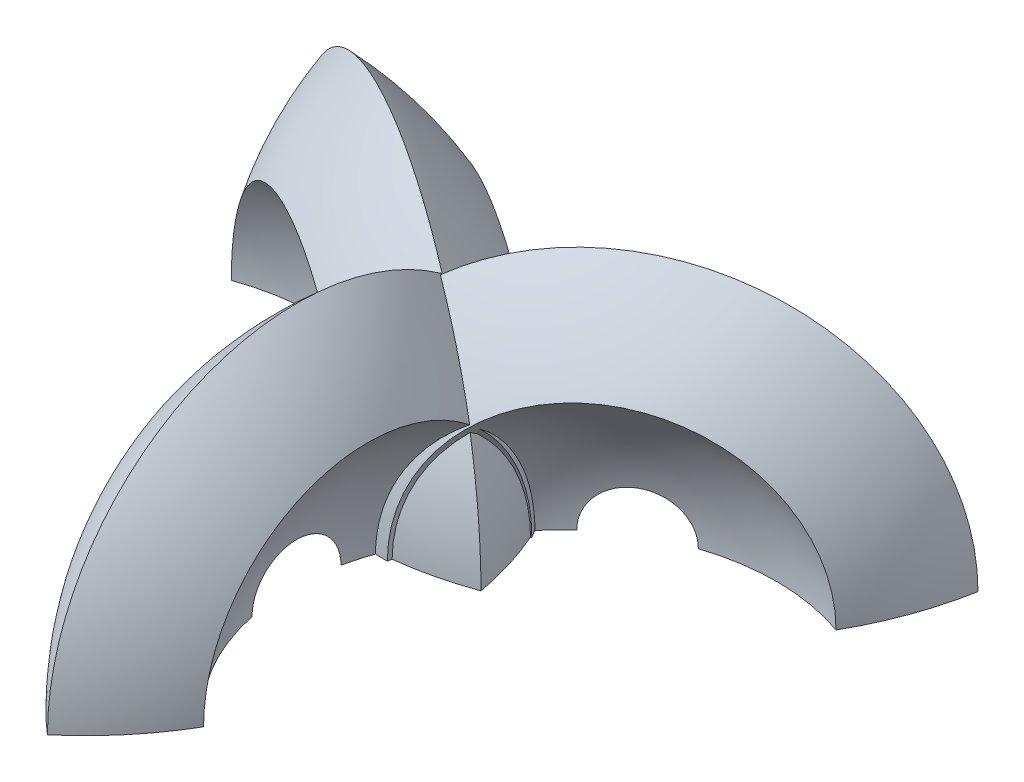
ISO-10303-21;
HEADER;
FILE_DESCRIPTION(('STEP AP214'),'2;1');
FILE_NAME('part.step','',(''),(''),'','','');
FILE_SCHEMA(('AUTOMOTIVE_DESIGN { 1 0 10303 214 1 1 1 1 }'));
ENDSEC;
DATA;
#1=APPLICATION_CONTEXT('core data for automotive mechanical design processes');
#2=APPLICATION_PROTOCOL_DEFINITION('international standard','automotive_design',2000,#1);
#3=PRODUCT_CONTEXT('',#1,'mechanical');
#4=PRODUCT('Part','Part','',(#3));
#5=PRODUCT_RELATED_PRODUCT_CATEGORY('part','',(#4));
#6=PRODUCT_DEFINITION_FORMATION('','',#4);
#7=PRODUCT_DEFINITION_CONTEXT('part definition',#1,'design');
#8=PRODUCT_DEFINITION('design','',#6,#7);
#9=PRODUCT_DEFINITION_SHAPE('','',#8);
#10=(LENGTH_UNIT() NAMED_UNIT(*) SI_UNIT(.MILLI.,.METRE.));
#11=(NAMED_UNIT(*) PLANE_ANGLE_UNIT() SI_UNIT($,.RADIAN.));
#12=(NAMED_UNIT(*) SI_UNIT($,.STERADIAN.) SOLID_ANGLE_UNIT());
#13=UNCERTAINTY_MEASURE_WITH_UNIT(LENGTH_MEASURE(1.E-05),#10,'distance_accuracy_value','');
#14=(GEOMETRIC_REPRESENTATION_CONTEXT(3) GLOBAL_UNCERTAINTY_ASSIGNED_CONTEXT((#13)) GLOBAL_UNIT_ASSIGNED_CONTEXT((#10,
#11,#12)) REPRESENTATION_CONTEXT('',''));
#15=CARTESIAN_POINT('',(0.,0.,0.));
#16=DIRECTION('',(0.,0.,1.));
#17=DIRECTION('',(1.,0.,0.));
#18=AXIS2_PLACEMENT_3D('',#15,#16,#17);
#19=CARTESIAN_POINT('',(-124.668530376757,0.,84.6505013948495));
#20=DIRECTION('',(-1.,0.,0.));
#21=DIRECTION('',(0.,0.,1.));
#22=AXIS2_PLACEMENT_3D('',#19,#20,#21);
#23=SPHERICAL_SURFACE('',#22,192.278);
#24=CARTESIAN_POINT('',(-129.95417514935,0.,74.795868958211));
#25=DIRECTION('',(-0.472664474793678,0.,-0.881242471892961));
#26=DIRECTION('',(-0.881242471892961,0.,0.472664474793678));
#27=AXIS2_PLACEMENT_3D('',#24,#25,#26);
#28=CIRCLE('',#27,191.952539610386);
#29=CARTESIAN_POINT('',(38.9671504604131,10.1232696352737,-15.8070152619315));
#30=VERTEX_POINT('',#29);
#31=CARTESIAN_POINT('',(39.2025553430375,-3.51186386520022E-13,-15.9332773620447));
#32=VERTEX_POINT('',#31);
#33=EDGE_CURVE('E313',#30,#32,#28,.T.);
#34=ORIENTED_EDGE('',*,*,#33,.F.);
#35=CARTESIAN_POINT('',(45.4636600559884,0.,72.0736056438837));
#36=DIRECTION('',(0.997278750361292,0.,-0.0737230905335674));
#37=DIRECTION('',(-0.0737230905335674,0.,-0.997278750361292));
#38=AXIS2_PLACEMENT_3D('',#35,#36,#37);
#39=CIRCLE('',#38,88.6999929866146);
#40=CARTESIAN_POINT('',(41.5264130904534,70.8201955717852,18.8130504333721));
#41=VERTEX_POINT('',#40);
#42=EDGE_CURVE('E391',#41,#30,#39,.F.);
#43=ORIENTED_EDGE('',*,*,#42,.F.);
#44=CARTESIAN_POINT('',(41.5264130904534,0.,84.6505013948495));
#45=DIRECTION('',(-1.,0.,0.));
#46=DIRECTION('',(0.,0.,1.));
#47=AXIS2_PLACEMENT_3D('',#44,#45,#46);
#48=CIRCLE('',#47,96.6957602479594);
#49=CARTESIAN_POINT('',(41.5264130904534,-3.33066907387547E-13,-12.0452588531098));
#50=VERTEX_POINT('',#49);
#51=EDGE_CURVE('E419',#41,#50,#48,.T.);
#52=ORIENTED_EDGE('',*,*,#51,.T.);
#53=CARTESIAN_POINT('',(-124.668530376757,0.,84.6505013948495));
#54=DIRECTION('',(0.,1.,0.));
#55=DIRECTION('',(1.,0.,0.));
#56=AXIS2_PLACEMENT_3D('',#53,#54,#55);
#57=CIRCLE('',#56,192.278);
#58=EDGE_CURVE('E395',#50,#32,#57,.T.);
#59=ORIENTED_EDGE('',*,*,#58,.T.);
#60=EDGE_LOOP('',(#34,#43,#52,#59));
#61=FACE_BOUND('',#60,.T.);
#62=ADVANCED_FACE('F38',(#61),#23,.T.);
#63=CARTESIAN_POINT('',(-50.7386392394072,0.,-68.9236544968015));
#64=DIRECTION('',(0.433752647348546,0.,-0.901031986623187));
#65=DIRECTION('',(-0.901031986623187,0.,-0.433752647348546));
#66=AXIS2_PLACEMENT_3D('',#63,#64,#65);
#67=CIRCLE('',#66,88.9953882096511);
#68=CARTESIAN_POINT('',(29.4490521994365,-4.01423188324392E-13,-30.3216692590538));
#69=VERTEX_POINT('',#68);
#70=CARTESIAN_POINT('',(-0.403929917464598,69.2781335055556,-44.6927573188496));
#71=VERTEX_POINT('',#70);
#72=EDGE_CURVE('E326',#69,#71,#67,.F.);
#73=ORIENTED_EDGE('',*,*,#72,.F.);
#74=CARTESIAN_POINT('',(-0.403929917464602,-5.13478148889135E-13,-62.0776089204288));
#75=VERTEX_POINT('',#74);
#76=EDGE_CURVE('E394',#69,#75,#57,.T.);
#77=ORIENTED_EDGE('',*,*,#76,.T.);
#78=CARTESIAN_POINT('',(-0.403929917464602,0.,84.6505013948495));
#79=DIRECTION('',(-1.,0.,0.));
#80=DIRECTION('',(0.,0.,1.));
#81=AXIS2_PLACEMENT_3D('',#78,#79,#80);
#82=CIRCLE('',#81,146.728110315278);
#83=EDGE_CURVE('E429',#71,#75,#82,.T.);
#84=ORIENTED_EDGE('',*,*,#83,.F.);
#85=EDGE_LOOP('',(#73,#77,#84));
#86=FACE_BOUND('',#85,.T.);
#87=ADVANCED_FACE('F519',(#86),#23,.T.);
#88=CARTESIAN_POINT('',(-68.0540382717353,0.,-32.9544714044507));
#89=DIRECTION('',(0.433752647348546,0.,-0.901031986623187));
#90=DIRECTION('',(-0.901031986623187,0.,-0.433752647348546));
#91=AXIS2_PLACEMENT_3D('',#88,#89,#90);
#92=CIRCLE('',#91,141.190293365253);
#93=CARTESIAN_POINT('',(-0.403929917464602,119.572522269939,-0.38802090356254));
#94=VERTEX_POINT('',#93);
#95=CARTESIAN_POINT('',(0.166197988731771,119.17287066736,-0.113563956071941));
#96=VERTEX_POINT('',#95);
#97=EDGE_CURVE('E306',#94,#96,#92,.T.);
#98=ORIENTED_EDGE('',*,*,#97,.F.);
#99=CARTESIAN_POINT('',(-0.403929917464602,-5.11118769209887E-13,231.378611710128));
#100=VERTEX_POINT('',#99);
#101=EDGE_CURVE('E430',#100,#94,#82,.T.);
#102=ORIENTED_EDGE('',*,*,#101,.F.);
#103=CARTESIAN_POINT('',(-124.668530376757,0.,84.6505013948495));
#104=DIRECTION('',(0.,-1.,0.));
#105=DIRECTION('',(1.,0.,0.));
#106=AXIS2_PLACEMENT_3D('',#103,#104,#105);
#107=CIRCLE('',#106,192.278);
#108=CARTESIAN_POINT('',(41.5264130904534,-3.42155977514452E-13,181.346261642809));
#109=VERTEX_POINT('',#108);
#110=EDGE_CURVE('E407',#109,#100,#107,.T.);
#111=ORIENTED_EDGE('',*,*,#110,.F.);
#112=CARTESIAN_POINT('',(41.5264130904534,75.747260840894,24.5470695042128));
#113=VERTEX_POINT('',#112);
#114=EDGE_CURVE('E420',#109,#113,#48,.T.);
#115=ORIENTED_EDGE('',*,*,#114,.T.);
#116=CARTESIAN_POINT('',(-56.6446904983197,0.,-32.4706182607864));
#117=DIRECTION('',(0.502235060310112,0.,-0.864731139832086));
#118=DIRECTION('',(-0.864731139832086,0.,-0.502235060310112));
#119=AXIS2_PLACEMENT_3D('',#116,#117,#118);
#120=CIRCLE('',#119,136.477946287314);
#121=CARTESIAN_POINT('',(0.215528319611667,119.593213683353,0.553745164838883));
#122=VERTEX_POINT('',#121);
#123=EDGE_CURVE('E372',#122,#113,#120,.T.);
#124=ORIENTED_EDGE('',*,*,#123,.F.);
#125=CARTESIAN_POINT('',(5.71977308335733,0.,75.0116429542923));
#126=DIRECTION('',(0.997278750361292,0.,-0.0737230905335674));
#127=DIRECTION('',(-0.0737230905335674,0.,-0.997278750361292));
#128=AXIS2_PLACEMENT_3D('',#125,#126,#127);
#129=CIRCLE('',#128,140.98514819922);
#130=EDGE_CURVE('E385',#96,#122,#129,.T.);
#131=ORIENTED_EDGE('',*,*,#130,.F.);
#132=EDGE_LOOP('',(#98,#102,#111,#115,#124,#131));
#133=FACE_BOUND('',#132,.T.);
#134=ADVANCED_FACE('F502',(#133),#23,.T.);
#135=CARTESIAN_POINT('',(123.860670541828,0.,84.6505013948495));
#136=DIRECTION('',(-1.,0.,0.));
#137=DIRECTION('',(0.,0.,1.));
#138=AXIS2_PLACEMENT_3D('',#135,#136,#137);
#139=SPHERICAL_SURFACE('',#138,192.278);
#140=CARTESIAN_POINT('',(37.0613763484214,0.,-66.2439891084989));
#141=DIRECTION('',(-0.498622054425052,0.,-0.866819500727193));
#142=DIRECTION('',(-0.866819500727193,0.,0.498622054425052));
#143=AXIS2_PLACEMENT_3D('',#140,#141,#142);
#144=CIRCLE('',#143,81.6551562809196);
#145=CARTESIAN_POINT('',(-4.60172868255597,66.0104840789844,-42.2780504017154));
#146=VERTEX_POINT('',#145);
#147=EDGE_CURVE('E53',#71,#146,#144,.F.);
#148=ORIENTED_EDGE('',*,*,#147,.F.);
#149=ORIENTED_EDGE('',*,*,#83,.T.);
#150=CARTESIAN_POINT('',(123.860670541828,0.,84.6505013948495));
#151=DIRECTION('',(0.,1.,0.));
#152=DIRECTION('',(1.,0.,0.));
#153=AXIS2_PLACEMENT_3D('',#150,#151,#152);
#154=CIRCLE('',#153,192.278);
#155=CARTESIAN_POINT('',(-30.6764375356947,-3.99452192276867E-13,-29.7571535546171));
#156=VERTEX_POINT('',#155);
#157=EDGE_CURVE('E397',#75,#156,#154,.T.);
#158=ORIENTED_EDGE('',*,*,#157,.T.);
#159=CARTESIAN_POINT('',(50.2601061040626,0.,-68.6223282256695));
#160=DIRECTION('',(-0.432872581520415,0.,-0.901455117112245));
#161=DIRECTION('',(-0.901455117112245,0.,0.432872581520415));
#162=AXIS2_PLACEMENT_3D('',#159,#160,#161);
#163=CIRCLE('',#162,89.7843299165381);
#164=EDGE_CURVE('E387',#146,#156,#163,.F.);
#165=ORIENTED_EDGE('',*,*,#164,.F.);
#166=EDGE_LOOP('',(#148,#149,#158,#165));
#167=FACE_BOUND('',#166,.T.);
#168=ADVANCED_FACE('F40',(#167),#139,.T.);
#169=CARTESIAN_POINT('',(37.0613763484214,0.,-66.2439891084989));
#170=DIRECTION('',(-0.498622054425052,0.,-0.866819500727193));
#171=DIRECTION('',(-0.866819500727193,0.,0.498622054425052));
#172=AXIS2_PLACEMENT_3D('',#169,#170,#171);
#173=CIRCLE('',#172,81.6551562809196);
#174=CARTESIAN_POINT('',(-30.8586778469745,22.9779023980061,-27.1742209143618));
#175=VERTEX_POINT('',#174);
#176=CARTESIAN_POINT('',(-33.7189054508063,-3.84689419314794E-13,-25.5289273293082));
#177=VERTEX_POINT('',#176);
#178=EDGE_CURVE('E239',#175,#177,#173,.F.);
#179=ORIENTED_EDGE('',*,*,#178,.F.);
#180=CARTESIAN_POINT('',(129.984373542649,0.,75.0116429542927));
#181=DIRECTION('',(0.536244828514143,0.,-0.844062488143998));
#182=DIRECTION('',(-0.844062488143998,0.,-0.536244828514144));
#183=AXIS2_PLACEMENT_3D('',#180,#181,#182);
#184=CIRCLE('',#183,191.938589016176);
#185=CARTESIAN_POINT('',(-32.0237894731927,-3.93018367142207E-13,-27.9144327979334));
#186=VERTEX_POINT('',#185);
#187=EDGE_CURVE('E382',#186,#175,#184,.T.);
#188=ORIENTED_EDGE('',*,*,#187,.F.);
#189=EDGE_CURVE('E401',#186,#177,#154,.T.);
#190=ORIENTED_EDGE('',*,*,#189,.T.);
#191=EDGE_LOOP('',(#179,#188,#190));
#192=FACE_BOUND('',#191,.T.);
#193=ADVANCED_FACE('F528',(#192),#139,.T.);
#194=CARTESIAN_POINT('',(56.2105621875569,0.,-32.9544714044507));
#195=DIRECTION('',(-0.498622054425052,0.,-0.866819500727193));
#196=DIRECTION('',(-0.866819500727193,0.,0.498622054425052));
#197=AXIS2_PLACEMENT_3D('',#194,#195,#196);
#198=CIRCLE('',#197,136.247431155715);
#199=CARTESIAN_POINT('',(-42.0106451206223,75.6552202855051,23.5454805867388));
#200=VERTEX_POINT('',#199);
#201=EDGE_CURVE('E61',#200,#94,#198,.T.);
#202=ORIENTED_EDGE('',*,*,#201,.F.);
#203=CARTESIAN_POINT('',(-45.6777758383489,0.,71.7540451205685));
#204=DIRECTION('',(-0.997119322550888,0.,-0.0758489063576901));
#205=DIRECTION('',(-0.0758489063576901,0.,0.997119322550888));
#206=AXIS2_PLACEMENT_3D('',#203,#204,#205);
#207=CIRCLE('',#206,89.7843299165372);
#208=CARTESIAN_POINT('',(-38.8677326061215,-3.57605013176243E-13,-17.7716451014946));
#209=VERTEX_POINT('',#208);
#210=EDGE_CURVE('E295',#209,#200,#207,.F.);
#211=ORIENTED_EDGE('',*,*,#210,.F.);
#212=CARTESIAN_POINT('',(-42.3342729253825,-3.33066907387547E-13,-12.0452588531099));
#213=VERTEX_POINT('',#212);
#214=EDGE_CURVE('E259',#209,#213,#154,.T.);
#215=ORIENTED_EDGE('',*,*,#214,.T.);
#216=CARTESIAN_POINT('',(-42.3342729253825,0.,84.6505013948495));
#217=DIRECTION('',(-1.,0.,0.));
#218=DIRECTION('',(0.,0.,1.));
#219=AXIS2_PLACEMENT_3D('',#216,#217,#218);
#220=CIRCLE('',#219,96.6957602479594);
#221=CARTESIAN_POINT('',(-42.3342729253825,-3.42155977514453E-13,181.346261642809));
#222=VERTEX_POINT('',#221);
#223=EDGE_CURVE('E426',#222,#213,#220,.T.);
#224=ORIENTED_EDGE('',*,*,#223,.F.);
#225=CARTESIAN_POINT('',(123.860670541828,0.,84.6505013948495));
#226=DIRECTION('',(0.,-1.,0.));
#227=DIRECTION('',(1.,0.,0.));
#228=AXIS2_PLACEMENT_3D('',#225,#226,#227);
#229=CIRCLE('',#228,192.278);
#230=EDGE_CURVE('E410',#100,#222,#229,.T.);
#231=ORIENTED_EDGE('',*,*,#230,.F.);
#232=ORIENTED_EDGE('',*,*,#101,.T.);
#233=EDGE_LOOP('',(#202,#211,#215,#224,#231,#232));
#234=FACE_BOUND('',#233,.T.);
#235=ADVANCED_FACE('F496',(#234),#139,.T.);
#236=CARTESIAN_POINT('',(-124.668530376757,0.,84.6505013948495));
#237=DIRECTION('',(-1.,0.,0.));
#238=DIRECTION('',(0.,0.,1.));
#239=AXIS2_PLACEMENT_3D('',#236,#237,#238);
#240=SPHERICAL_SURFACE('',#239,127.);
#241=CARTESIAN_POINT('',(-85.3694373040633,0.,3.01471168790013));
#242=DIRECTION('',(0.433752647348546,0.,-0.901031986623187));
#243=DIRECTION('',(-0.901031986623187,0.,-0.433752647348546));
#244=AXIS2_PLACEMENT_3D('',#241,#242,#243);
#245=CIRCLE('',#244,88.9953882096512);
#246=CARTESIAN_POINT('',(-8.10000083926831,23.7904453092196,40.2118624254039));
#247=VERTEX_POINT('',#246);
#248=CARTESIAN_POINT('',(-38.3369613817749,72.0798211251422,25.655928920492));
#249=VERTEX_POINT('',#248);
#250=EDGE_CURVE('E297',#247,#249,#245,.F.);
#251=ORIENTED_EDGE('',*,*,#250,.F.);
#252=CARTESIAN_POINT('',(-75.9656527928002,0.,0.79555343428124));
#253=DIRECTION('',(0.502235060310112,0.,-0.864731139832086));
#254=DIRECTION('',(-0.864731139832086,0.,-0.502235060310112));
#255=AXIS2_PLACEMENT_3D('',#252,#253,#254);
#256=CIRCLE('',#255,82.0083984575516);
#257=CARTESIAN_POINT('',(-5.05043691879777,-3.69653506053159E-13,41.9830463795454));
#258=VERTEX_POINT('',#257);
#259=EDGE_CURVE('E376',#258,#247,#256,.F.);
#260=ORIENTED_EDGE('',*,*,#259,.F.);
#261=CARTESIAN_POINT('',(-124.668530376757,0.,84.6505013948495));
#262=DIRECTION('',(0.,-1.,0.));
#263=DIRECTION('',(1.,0.,0.));
#264=AXIS2_PLACEMENT_3D('',#261,#262,#263);
#265=CIRCLE('',#264,127.);
#266=CARTESIAN_POINT('',(-0.403929917464574,0.,58.433921284307));
#267=VERTEX_POINT('',#266);
#268=EDGE_CURVE('E400',#258,#267,#265,.T.);
#269=ORIENTED_EDGE('',*,*,#268,.T.);
#270=CARTESIAN_POINT('',(-0.403929917464574,0.,84.6505013948495));
#271=DIRECTION('',(-1.,0.,0.));
#272=DIRECTION('',(0.,0.,1.));
#273=AXIS2_PLACEMENT_3D('',#270,#271,#272);
#274=CIRCLE('',#273,26.2165801105425);
#275=CARTESIAN_POINT('',(-0.403929917464574,0.,110.867081505392));
#276=VERTEX_POINT('',#275);
#277=EDGE_CURVE('E423',#276,#267,#274,.T.);
#278=ORIENTED_EDGE('',*,*,#277,.F.);
#279=CARTESIAN_POINT('',(-124.668530376757,0.,84.6505013948495));
#280=DIRECTION('',(0.,1.,0.));
#281=DIRECTION('',(1.,0.,0.));
#282=AXIS2_PLACEMENT_3D('',#279,#280,#281);
#283=CIRCLE('',#282,127.);
#284=EDGE_CURVE('E413',#222,#276,#283,.T.);
#285=ORIENTED_EDGE('',*,*,#284,.F.);
#286=ORIENTED_EDGE('',*,*,#223,.T.);
#287=CARTESIAN_POINT('',(-40.5633515025527,-3.32247406505919E-13,-10.5089378980454));
#288=VERTEX_POINT('',#287);
#289=EDGE_CURVE('E402',#213,#288,#265,.T.);
#290=ORIENTED_EDGE('',*,*,#289,.T.);
#291=CARTESIAN_POINT('',(-34.0241138892737,0.,77.9496802647009));
#292=DIRECTION('',(0.997278750361292,0.,-0.0737230905335674));
#293=DIRECTION('',(-0.0737230905335674,0.,-0.997278750361292));
#294=AXIS2_PLACEMENT_3D('',#291,#292,#293);
#295=CIRCLE('',#294,88.6999929866146);
#296=CARTESIAN_POINT('',(-38.1019938363555,69.3405278792349,22.7867321528413));
#297=VERTEX_POINT('',#296);
#298=EDGE_CURVE('E379',#297,#288,#295,.F.);
#299=ORIENTED_EDGE('',*,*,#298,.F.);
#300=CARTESIAN_POINT('',(-35.6465103322736,67.4638661183998,24.2128747409323));
#301=VERTEX_POINT('',#300);
#302=EDGE_CURVE('E375',#301,#297,#256,.F.);
#303=ORIENTED_EDGE('',*,*,#302,.F.);
#304=CARTESIAN_POINT('',(-129.95417514935,0.,74.7958689582107));
#305=DIRECTION('',(-0.472664474793678,0.,-0.881242471892961));
#306=DIRECTION('',(-0.881242471892961,0.,0.472664474793678));
#307=AXIS2_PLACEMENT_3D('',#304,#305,#306);
#308=CIRCLE('',#307,126.506711991407);
#309=EDGE_CURVE('E292',#249,#301,#308,.T.);
#310=ORIENTED_EDGE('',*,*,#309,.F.);
#311=EDGE_LOOP('',(#251,#260,#269,#278,#285,#286,#290,#299,#303,#310));
#312=FACE_BOUND('',#311,.T.);
#313=ADVANCED_FACE('F477',(#312),#240,.F.);
#314=CARTESIAN_POINT('',(123.860670541828,0.,84.6505013948495));
#315=DIRECTION('',(-1.,0.,0.));
#316=DIRECTION('',(0.,0.,1.));
#317=AXIS2_PLACEMENT_3D('',#314,#315,#316);
#318=SPHERICAL_SURFACE('',#317,127.);
#319=CARTESIAN_POINT('',(34.2986264582324,0.,77.8376927958533));
#320=DIRECTION('',(-0.997119322550888,0.,-0.0758489063576901));
#321=DIRECTION('',(-0.0758489063576901,0.,0.997119322550888));
#322=AXIS2_PLACEMENT_3D('',#319,#320,#321);
#323=CIRCLE('',#322,89.7843299165372);
#324=CARTESIAN_POINT('',(41.1086696904598,-3.36364070845889E-13,-11.6879974262097));
#325=VERTEX_POINT('',#324);
#326=CARTESIAN_POINT('',(38.9147300116422,66.0104840789842,17.1538112604408));
#327=VERTEX_POINT('',#326);
#328=EDGE_CURVE('E310',#325,#327,#323,.F.);
#329=ORIENTED_EDGE('',*,*,#328,.F.);
#330=CARTESIAN_POINT('',(123.860670541828,0.,84.6505013948495));
#331=DIRECTION('',(0.,-1.,0.));
#332=DIRECTION('',(1.,0.,0.));
#333=AXIS2_PLACEMENT_3D('',#330,#331,#332);
#334=CIRCLE('',#333,127.);
#335=EDGE_CURVE('E404',#325,#50,#334,.T.);
#336=ORIENTED_EDGE('',*,*,#335,.T.);
#337=ORIENTED_EDGE('',*,*,#51,.F.);
#338=CARTESIAN_POINT('',(129.984373542649,0.,75.0116429542926));
#339=DIRECTION('',(0.536244828514143,0.,-0.844062488143998));
#340=DIRECTION('',(-0.844062488143998,0.,-0.536244828514144));
#341=AXIS2_PLACEMENT_3D('',#338,#339,#340);
#342=CIRCLE('',#341,126.485543322234);
#343=EDGE_CURVE('E389',#327,#41,#342,.T.);
#344=ORIENTED_EDGE('',*,*,#343,.F.);
#345=EDGE_LOOP('',(#329,#336,#337,#344));
#346=FACE_BOUND('',#345,.T.);
#347=ADVANCED_FACE('F456',(#346),#318,.F.);
#348=CARTESIAN_POINT('',(136.108076543472,0.,65.3727845137351));
#349=DIRECTION('',(0.501867130525979,0.,0.864944728463976));
#350=DIRECTION('',(0.864944728463976,0.,-0.501867130525979));
#351=AXIS2_PLACEMENT_3D('',#348,#349,#350);
#352=SPHERICAL_SURFACE('',#351,192.278);
#353=CARTESIAN_POINT('',(39.854031490831,0.,-75.4925855242141));
#354=DIRECTION('',(-0.564174691148556,0.,-0.82565544742794));
#355=DIRECTION('',(-0.82565544742794,0.,0.564174691148556));
#356=AXIS2_PLACEMENT_3D('',#353,#354,#355);
#357=CIRCLE('',#356,88.673195606541);
#358=CARTESIAN_POINT('',(-4.47779559113292,70.5691801499423,-45.2004159152915));
#359=VERTEX_POINT('',#358);
#360=EDGE_CURVE('E322',#359,#175,#357,.F.);
#361=ORIENTED_EDGE('',*,*,#360,.F.);
#362=CARTESIAN_POINT('',(52.7002010029481,0.,-78.3768214537765));
#363=DIRECTION('',(0.501867130525979,0.,0.864944728463976));
#364=DIRECTION('',(0.864944728463976,0.,-0.501867130525979));
#365=AXIS2_PLACEMENT_3D('',#362,#363,#364);
#366=CIRCLE('',#365,96.6954309468744);
#367=CARTESIAN_POINT('',(-30.9360022611033,-3.60822483003176E-13,-29.8485629894957));
#368=VERTEX_POINT('',#367);
#369=EDGE_CURVE('E362',#359,#368,#366,.T.);
#370=ORIENTED_EDGE('',*,*,#369,.T.);
#371=CARTESIAN_POINT('',(136.108076543472,0.,65.3727845137351));
#372=DIRECTION('',(0.,1.,0.));
#373=DIRECTION('',(-0.501867130525979,0.,-0.864944728463976));
#374=AXIS2_PLACEMENT_3D('',#371,#372,#373);
#375=CIRCLE('',#374,192.278);
#376=EDGE_CURVE('E336',#368,#186,#375,.T.);
#377=ORIENTED_EDGE('',*,*,#376,.T.);
#378=ORIENTED_EDGE('',*,*,#187,.T.);
#379=EDGE_LOOP('',(#361,#370,#377,#378));
#380=FACE_BOUND('',#379,.T.);
#381=ADVANCED_FACE('F526',(#380),#352,.T.);
#382=CARTESIAN_POINT('',(0.434128310763754,0.,65.1570105176537));
#383=DIRECTION('',(-0.999998735338019,0.,-0.00159038434431163));
#384=DIRECTION('',(-0.00159038434431163,0.,0.999998735338019));
#385=AXIS2_PLACEMENT_3D('',#382,#383,#384);
#386=CIRCLE('',#385,136.247431155714);
#387=CARTESIAN_POINT('',(0.538338153738816,119.456453929357,-0.367849279702834));
#388=VERTEX_POINT('',#387);
#389=CARTESIAN_POINT('',(0.614338227881655,75.6552202855054,-48.1550261972011));
#390=VERTEX_POINT('',#389);
#391=EDGE_CURVE('E319',#388,#390,#386,.T.);
#392=ORIENTED_EDGE('',*,*,#391,.F.);
#393=CARTESIAN_POINT('',(62.3342651883789,0.,-42.5933298450079));
#394=DIRECTION('',(-0.564174691148556,0.,-0.82565544742794));
#395=DIRECTION('',(-0.82565544742794,0.,0.564174691148556));
#396=AXIS2_PLACEMENT_3D('',#393,#394,#395);
#397=CIRCLE('',#396,140.966564093823);
#398=EDGE_CURVE('E303',#96,#388,#397,.T.);
#399=ORIENTED_EDGE('',*,*,#398,.F.);
#400=ORIENTED_EDGE('',*,*,#130,.T.);
#401=CARTESIAN_POINT('',(73.7436129617944,0.,-42.1094767013436));
#402=DIRECTION('',(0.501867130525979,0.,0.864944728463976));
#403=DIRECTION('',(0.864944728463976,0.,-0.501867130525979));
#404=AXIS2_PLACEMENT_3D('',#401,#402,#403);
#405=CIRCLE('',#404,146.727865418479);
#406=CARTESIAN_POINT('',(200.655106674279,-5.11117059104678E-13,-115.747369487118));
#407=VERTEX_POINT('',#406);
#408=EDGE_CURVE('E359',#407,#122,#405,.T.);
#409=ORIENTED_EDGE('',*,*,#408,.F.);
#410=CARTESIAN_POINT('',(136.108076543472,0.,65.3727845137351));
#411=DIRECTION('',(0.,-1.,0.));
#412=DIRECTION('',(-0.501867130525979,0.,-0.864944728463976));
#413=AXIS2_PLACEMENT_3D('',#410,#411,#412);
#414=CIRCLE('',#413,192.278);
#415=CARTESIAN_POINT('',(136.336404266999,-3.14398102401638E-13,-126.905079918057));
#416=VERTEX_POINT('',#415);
#417=EDGE_CURVE('E349',#416,#407,#414,.T.);
#418=ORIENTED_EDGE('',*,*,#417,.F.);
#419=EDGE_CURVE('E363',#416,#390,#366,.T.);
#420=ORIENTED_EDGE('',*,*,#419,.T.);
#421=EDGE_LOOP('',(#392,#399,#400,#409,#418,#420));
#422=FACE_BOUND('',#421,.T.);
#423=ADVANCED_FACE('F585',(#422),#352,.T.);
#424=CARTESIAN_POINT('',(11.3791493801173,0.,-149.591737916422));
#425=DIRECTION('',(0.501867130525979,0.,0.864944728463976));
#426=DIRECTION('',(0.864944728463976,0.,-0.501867130525979));
#427=AXIS2_PLACEMENT_3D('',#424,#425,#426);
#428=SPHERICAL_SURFACE('',#427,127.);
#429=CARTESIAN_POINT('',(-0.0301983932988956,0.,-150.075591060087));
#430=DIRECTION('',(-0.999101971371275,0.,-0.0423704000692854));
#431=DIRECTION('',(-0.0423704000692854,0.,0.999101971371275));
#432=AXIS2_PLACEMENT_3D('',#429,#430,#431);
#433=CIRCLE('',#432,126.485543322234);
#434=EDGE_CURVE('E11',#146,#359,#433,.T.);
#435=ORIENTED_EDGE('',*,*,#434,.F.);
#436=ORIENTED_EDGE('',*,*,#164,.T.);
#437=CARTESIAN_POINT('',(11.3791493801173,0.,-149.591737916422));
#438=DIRECTION('',(0.,-1.,0.));
#439=DIRECTION('',(-0.501867130525979,0.,-0.864944728463976));
#440=AXIS2_PLACEMENT_3D('',#437,#438,#439);
#441=CIRCLE('',#440,127.);
#442=EDGE_CURVE('E332',#156,#368,#441,.T.);
#443=ORIENTED_EDGE('',*,*,#442,.T.);
#444=ORIENTED_EDGE('',*,*,#369,.F.);
#445=EDGE_LOOP('',(#435,#436,#443,#444));
#446=FACE_BOUND('',#445,.T.);
#447=ADVANCED_FACE('F522',(#446),#428,.F.);
#448=CARTESIAN_POINT('',(-39.3019379795325,0.,-75.4351368246653));
#449=DIRECTION('',(-0.564246741030475,0.,0.825606210754551));
#450=DIRECTION('',(0.825606210754551,0.,0.564246741030475));
#451=AXIS2_PLACEMENT_3D('',#448,#449,#450);
#452=CIRCLE('',#451,89.7843299165372);
#453=CARTESIAN_POINT('',(34.8245624279965,-1.3563001139559E-13,-24.7746212736542));
#454=VERTEX_POINT('',#453);
#455=EDGE_CURVE('E316',#390,#454,#452,.F.);
#456=ORIENTED_EDGE('',*,*,#455,.F.);
#457=ORIENTED_EDGE('',*,*,#419,.F.);
#458=CARTESIAN_POINT('',(11.3791493801173,0.,-149.591737916422));
#459=DIRECTION('',(0.,1.,0.));
#460=DIRECTION('',(-0.501867130525979,0.,-0.864944728463976));
#461=AXIS2_PLACEMENT_3D('',#458,#459,#460);
#462=CIRCLE('',#461,127.);
#463=CARTESIAN_POINT('',(96.4183201771242,0.,-55.2660286418162));
#464=VERTEX_POINT('',#463);
#465=EDGE_CURVE('E346',#464,#416,#462,.T.);
#466=ORIENTED_EDGE('',*,*,#465,.F.);
#467=CARTESIAN_POINT('',(73.7436129617944,0.,-42.1094767013435));
#468=DIRECTION('',(0.501867130525979,0.,0.864944728463976));
#469=DIRECTION('',(0.864944728463976,0.,-0.501867130525979));
#470=AXIS2_PLACEMENT_3D('',#467,#468,#469);
#471=CIRCLE('',#470,26.2152094453446);
#472=CARTESIAN_POINT('',(51.0689057464646,0.,-28.9529247608709));
#473=VERTEX_POINT('',#472);
#474=EDGE_CURVE('E366',#464,#473,#471,.T.);
#475=ORIENTED_EDGE('',*,*,#474,.T.);
#476=EDGE_CURVE('E333',#473,#454,#441,.T.);
#477=ORIENTED_EDGE('',*,*,#476,.T.);
#478=EDGE_LOOP('',(#456,#457,#466,#475,#477));
#479=FACE_BOUND('',#478,.T.);
#480=ADVANCED_FACE('F600',(#479),#428,.F.);
#481=CARTESIAN_POINT('',(136.108076543472,0.,65.3727845137351));
#482=DIRECTION('',(0.501867130525979,0.,0.864944728463976));
#483=DIRECTION('',(0.864944728463976,0.,-0.501867130525979));
#484=AXIS2_PLACEMENT_3D('',#481,#482,#483);
#485=SPHERICAL_SURFACE('',#484,127.);
#486=CARTESIAN_POINT('',(38.838289241769,0.,65.2180879711971));
#487=DIRECTION('',(-0.999998735338019,0.,-0.00159038434431163));
#488=DIRECTION('',(-0.00159038434431163,0.,0.999998735338019));
#489=AXIS2_PLACEMENT_3D('',#486,#487,#488);
#490=CIRCLE('',#489,81.6551562809188);
#491=CARTESIAN_POINT('',(38.9681523239505,-3.91428313586895E-13,-16.4369650435501));
#492=VERTEX_POINT('',#491);
#493=EDGE_CURVE('E46',#492,#30,#490,.F.);
#494=ORIENTED_EDGE('',*,*,#493,.F.);
#495=CARTESIAN_POINT('',(136.108076543472,0.,65.3727845137351));
#496=DIRECTION('',(0.,-1.,0.));
#497=DIRECTION('',(-0.501867130525979,0.,-0.864944728463976));
#498=AXIS2_PLACEMENT_3D('',#495,#496,#497);
#499=CIRCLE('',#498,127.);
#500=EDGE_CURVE('E329',#492,#473,#499,.T.);
#501=ORIENTED_EDGE('',*,*,#500,.T.);
#502=ORIENTED_EDGE('',*,*,#474,.F.);
#503=CARTESIAN_POINT('',(136.108076543472,0.,65.3727845137351));
#504=DIRECTION('',(0.,1.,0.));
#505=DIRECTION('',(-0.501867130525979,0.,-0.864944728463976));
#506=AXIS2_PLACEMENT_3D('',#503,#504,#505);
#507=CIRCLE('',#506,127.);
#508=CARTESIAN_POINT('',(178.423228184692,-3.56031465825081E-13,-54.3703904131915));
#509=VERTEX_POINT('',#508);
#510=EDGE_CURVE('E342',#509,#464,#507,.T.);
#511=ORIENTED_EDGE('',*,*,#510,.F.);
#512=CARTESIAN_POINT('',(94.7870249206407,0.,-5.84213194891074));
#513=DIRECTION('',(0.501867130525979,0.,0.864944728463976));
#514=DIRECTION('',(0.864944728463976,0.,-0.501867130525979));
#515=AXIS2_PLACEMENT_3D('',#512,#513,#514);
#516=CIRCLE('',#515,96.6954309468744);
#517=CARTESIAN_POINT('',(11.1508216565893,-3.19189119579733E-13,42.6861265153701));
#518=VERTEX_POINT('',#517);
#519=EDGE_CURVE('E355',#509,#518,#516,.T.);
#520=ORIENTED_EDGE('',*,*,#519,.T.);
#521=CARTESIAN_POINT('',(11.6009918925429,-3.41890550319119E-13,40.3330985786741));
#522=VERTEX_POINT('',#521);
#523=EDGE_CURVE('E330',#518,#522,#499,.T.);
#524=ORIENTED_EDGE('',*,*,#523,.T.);
#525=CARTESIAN_POINT('',(84.8144988859268,0.,-9.69407416580165));
#526=DIRECTION('',(-0.564174691148556,0.,-0.82565544742794));
#527=DIRECTION('',(-0.82565544742794,0.,0.564174691148556));
#528=AXIS2_PLACEMENT_3D('',#525,#526,#527);
#529=CIRCLE('',#528,88.673195606541);
#530=CARTESIAN_POINT('',(38.907540543492,69.0760898962029,21.6743908822935));
#531=VERTEX_POINT('',#530);
#532=EDGE_CURVE('E300',#531,#522,#529,.F.);
#533=ORIENTED_EDGE('',*,*,#532,.F.);
#534=EDGE_CURVE('E437',#327,#531,#490,.F.);
#535=ORIENTED_EDGE('',*,*,#534,.F.);
#536=ORIENTED_EDGE('',*,*,#343,.T.);
#537=ORIENTED_EDGE('',*,*,#42,.T.);
#538=EDGE_LOOP('',(#494,#501,#502,#511,#520,#524,#533,#535,#536,#537));
#539=FACE_BOUND('',#538,.T.);
#540=ADVANCED_FACE('F448',(#539),#485,.F.);
#541=CARTESIAN_POINT('',(11.3791493801173,0.,-149.591737916422));
#542=DIRECTION('',(0.501867130525979,0.,0.864944728463976));
#543=DIRECTION('',(0.864944728463976,0.,-0.501867130525979));
#544=AXIS2_PLACEMENT_3D('',#541,#542,#543);
#545=SPHERICAL_SURFACE('',#544,192.278);
#546=CARTESIAN_POINT('',(-0.0301983932979085,0.,-150.075591060087));
#547=DIRECTION('',(-0.999101971371275,0.,-0.0423704000692854));
#548=DIRECTION('',(-0.0423704000692854,0.,0.999101971371275));
#549=AXIS2_PLACEMENT_3D('',#546,#547,#548);
#550=CIRCLE('',#549,191.938589016176);
#551=CARTESIAN_POINT('',(-8.16271319864735,-3.58304551206145E-13,41.6906316081962));
#552=VERTEX_POINT('',#551);
#553=EDGE_CURVE('E435',#552,#247,#550,.T.);
#554=ORIENTED_EDGE('',*,*,#553,.F.);
#555=CARTESIAN_POINT('',(11.3791493801173,0.,-149.591737916422));
#556=DIRECTION('',(0.,1.,0.));
#557=DIRECTION('',(-0.501867130525979,0.,-0.864944728463976));
#558=AXIS2_PLACEMENT_3D('',#555,#556,#557);
#559=CIRCLE('',#558,192.278);
#560=EDGE_CURVE('E343',#552,#258,#559,.T.);
#561=ORIENTED_EDGE('',*,*,#560,.T.);
#562=ORIENTED_EDGE('',*,*,#259,.T.);
#563=EDGE_LOOP('',(#554,#561,#562));
#564=FACE_BOUND('',#563,.T.);
#565=ADVANCED_FACE('F473',(#564),#545,.T.);
#566=CARTESIAN_POINT('',(-84.5587325622943,0.,-9.21536457018457));
#567=DIRECTION('',(-0.564246741030475,0.,0.825606210754551));
#568=DIRECTION('',(0.825606210754551,0.,0.564246741030475));
#569=AXIS2_PLACEMENT_3D('',#566,#567,#568);
#570=CIRCLE('',#569,89.7843299165372);
#571=CARTESIAN_POINT('',(-10.4322321547654,-3.85338335801203E-13,41.4451509808266));
#572=VERTEX_POINT('',#571);
#573=EDGE_CURVE('E432',#301,#572,#570,.F.);
#574=ORIENTED_EDGE('',*,*,#573,.F.);
#575=ORIENTED_EDGE('',*,*,#302,.T.);
#576=CARTESIAN_POINT('',(-53.1678807506907,-5.13478148889135E-13,31.5284160844305));
#577=VERTEX_POINT('',#576);
#578=EDGE_CURVE('E358',#297,#577,#405,.T.);
#579=ORIENTED_EDGE('',*,*,#578,.T.);
#580=EDGE_CURVE('E340',#577,#572,#559,.T.);
#581=ORIENTED_EDGE('',*,*,#580,.T.);
#582=EDGE_LOOP('',(#574,#575,#579,#581));
#583=FACE_BOUND('',#582,.T.);
#584=ADVANCED_FACE('F489',(#583),#545,.T.);
#585=CARTESIAN_POINT('',(84.9797138178823,0.,3.68109170409682));
#586=DIRECTION('',(-0.432872581520415,0.,-0.901455117112245));
#587=DIRECTION('',(-0.901455117112245,0.,0.432872581520415));
#588=AXIS2_PLACEMENT_3D('',#585,#586,#587);
#589=CIRCLE('',#588,89.784329916538);
#590=CARTESIAN_POINT('',(4.04317017812507,-1.47006150857549E-13,42.5462663751493));
#591=VERTEX_POINT('',#590);
#592=EDGE_CURVE('E369',#113,#591,#589,.F.);
#593=ORIENTED_EDGE('',*,*,#592,.F.);
#594=ORIENTED_EDGE('',*,*,#114,.F.);
#595=CARTESIAN_POINT('',(123.860670541828,0.,84.6505013948495));
#596=DIRECTION('',(0.,1.,0.));
#597=DIRECTION('',(1.,0.,0.));
#598=AXIS2_PLACEMENT_3D('',#595,#596,#597);
#599=CIRCLE('',#598,127.);
#600=EDGE_CURVE('E416',#276,#109,#599,.T.);
#601=ORIENTED_EDGE('',*,*,#600,.F.);
#602=ORIENTED_EDGE('',*,*,#277,.T.);
#603=EDGE_CURVE('E405',#267,#591,#334,.T.);
#604=ORIENTED_EDGE('',*,*,#603,.T.);
#605=EDGE_LOOP('',(#593,#594,#601,#602,#604));
#606=FACE_BOUND('',#605,.T.);
#607=ADVANCED_FACE('F577',(#606),#318,.F.);
#608=CARTESIAN_POINT('',(-0.403929917464609,0.,84.6505013948495));
#609=DIRECTION('',(0.,-1.,0.));
#610=DIRECTION('',(1.,0.,0.));
#611=AXIS2_PLACEMENT_3D('',#608,#609,#610);
#612=PLANE('',#611);
#613=ORIENTED_EDGE('',*,*,#110,.T.);
#614=ORIENTED_EDGE('',*,*,#230,.T.);
#615=ORIENTED_EDGE('',*,*,#284,.T.);
#616=ORIENTED_EDGE('',*,*,#600,.T.);
#617=EDGE_LOOP('',(#613,#614,#615,#616));
#618=FACE_BOUND('',#617,.T.);
#619=ADVANCED_FACE('F498',(#618),#612,.T.);
#620=CARTESIAN_POINT('',(-0.403929917464609,0.,84.6505013948495));
#621=DIRECTION('',(0.,1.,0.));
#622=DIRECTION('',(1.,0.,0.));
#623=AXIS2_PLACEMENT_3D('',#620,#621,#622);
#624=PLANE('',#623);
#625=ORIENTED_EDGE('',*,*,#76,.F.);
#626=CARTESIAN_POINT('',(-11.4395461667138,0.,-150.559444203751));
#627=DIRECTION('',(0.,-1.,0.));
#628=DIRECTION('',(-0.498130542456249,0.,0.867102048591885));
#629=AXIS2_PLACEMENT_3D('',#626,#627,#628);
#630=CIRCLE('',#629,127.);
#631=CARTESIAN_POINT('',(31.3918591231723,-3.46944695195361E-13,-30.9999580853608));
#632=VERTEX_POINT('',#631);
#633=EDGE_CURVE('E243',#632,#69,#630,.T.);
#634=ORIENTED_EDGE('',*,*,#633,.F.);
#635=CARTESIAN_POINT('',(-135.239819921944,0.,64.9412365215721));
#636=DIRECTION('',(0.,1.,0.));
#637=DIRECTION('',(-0.498130542456249,0.,0.867102048591885));
#638=AXIS2_PLACEMENT_3D('',#635,#636,#637);
#639=CIRCLE('',#638,192.278);
#640=EDGE_CURVE('E269',#454,#632,#639,.T.);
#641=ORIENTED_EDGE('',*,*,#640,.F.);
#642=ORIENTED_EDGE('',*,*,#476,.F.);
#643=ORIENTED_EDGE('',*,*,#500,.F.);
#644=EDGE_CURVE('E274',#32,#492,#639,.T.);
#645=ORIENTED_EDGE('',*,*,#644,.F.);
#646=ORIENTED_EDGE('',*,*,#58,.F.);
#647=ORIENTED_EDGE('',*,*,#335,.F.);
#648=CARTESIAN_POINT('',(53.8883496455481,-5.41233724504764E-13,30.2805273532649));
#649=VERTEX_POINT('',#648);
#650=EDGE_CURVE('E270',#649,#325,#639,.T.);
#651=ORIENTED_EDGE('',*,*,#650,.F.);
#652=CARTESIAN_POINT('',(-11.4395461667138,0.,-150.559444203751));
#653=DIRECTION('',(0.,1.,0.));
#654=DIRECTION('',(-0.498130542456249,0.,0.867102048591885));
#655=AXIS2_PLACEMENT_3D('',#652,#653,#654);
#656=CIRCLE('',#655,192.278);
#657=EDGE_CURVE('E260',#522,#649,#656,.T.);
#658=ORIENTED_EDGE('',*,*,#657,.F.);
#659=ORIENTED_EDGE('',*,*,#523,.F.);
#660=EDGE_CURVE('E339',#591,#518,#559,.T.);
#661=ORIENTED_EDGE('',*,*,#660,.F.);
#662=ORIENTED_EDGE('',*,*,#603,.F.);
#663=ORIENTED_EDGE('',*,*,#268,.F.);
#664=ORIENTED_EDGE('',*,*,#560,.F.);
#665=CARTESIAN_POINT('',(-10.3816126848115,-3.33066907387547E-13,41.715645344396));
#666=VERTEX_POINT('',#665);
#667=EDGE_CURVE('E264',#666,#552,#656,.T.);
#668=ORIENTED_EDGE('',*,*,#667,.F.);
#669=CARTESIAN_POINT('',(-135.239819921944,0.,64.9412365215721));
#670=DIRECTION('',(0.,-1.,0.));
#671=DIRECTION('',(-0.498130542456249,0.,0.867102048591885));
#672=AXIS2_PLACEMENT_3D('',#669,#670,#671);
#673=CIRCLE('',#672,127.);
#674=EDGE_CURVE('E261',#572,#666,#673,.T.);
#675=ORIENTED_EDGE('',*,*,#674,.F.);
#676=ORIENTED_EDGE('',*,*,#580,.F.);
#677=EDGE_CURVE('E335',#288,#577,#375,.T.);
#678=ORIENTED_EDGE('',*,*,#677,.F.);
#679=ORIENTED_EDGE('',*,*,#289,.F.);
#680=ORIENTED_EDGE('',*,*,#214,.F.);
#681=CARTESIAN_POINT('',(-50.608421230008,0.,-29.7505073394774));
#682=VERTEX_POINT('',#681);
#683=EDGE_CURVE('E248',#682,#209,#673,.T.);
#684=ORIENTED_EDGE('',*,*,#683,.F.);
#685=EDGE_CURVE('E231',#177,#682,#630,.T.);
#686=ORIENTED_EDGE('',*,*,#685,.F.);
#687=ORIENTED_EDGE('',*,*,#189,.F.);
#688=ORIENTED_EDGE('',*,*,#376,.F.);
#689=ORIENTED_EDGE('',*,*,#442,.F.);
#690=ORIENTED_EDGE('',*,*,#157,.F.);
#691=EDGE_LOOP('',(#625,#634,#641,#642,#643,#645,#646,#647,#651,#658,#659,#661,#662,#663,#664,
#668,#675,#676,#678,#679,#680,#684,#686,#687,#688,#689,#690));
#692=FACE_BOUND('',#691,.T.);
#693=ADVANCED_FACE('F257',(#692),#624,.F.);
#694=CARTESIAN_POINT('',(73.7436129617944,0.,-42.1094767013435));
#695=DIRECTION('',(0.,-1.,0.));
#696=DIRECTION('',(-0.501867130525979,0.,-0.864944728463976));
#697=AXIS2_PLACEMENT_3D('',#694,#695,#696);
#698=PLANE('',#697);
#699=ORIENTED_EDGE('',*,*,#510,.T.);
#700=ORIENTED_EDGE('',*,*,#465,.T.);
#701=ORIENTED_EDGE('',*,*,#417,.T.);
#702=CARTESIAN_POINT('',(11.3791493801173,0.,-149.591737916422));
#703=DIRECTION('',(0.,-1.,0.));
#704=DIRECTION('',(-0.501867130525979,0.,-0.864944728463976));
#705=AXIS2_PLACEMENT_3D('',#702,#703,#704);
#706=CIRCLE('',#705,192.278);
#707=EDGE_CURVE('E352',#407,#509,#706,.T.);
#708=ORIENTED_EDGE('',*,*,#707,.T.);
#709=EDGE_LOOP('',(#699,#700,#701,#708));
#710=FACE_BOUND('',#709,.T.);
#711=ADVANCED_FACE('F639',(#710),#698,.T.);
#712=ORIENTED_EDGE('',*,*,#408,.T.);
#713=ORIENTED_EDGE('',*,*,#123,.T.);
#714=ORIENTED_EDGE('',*,*,#592,.T.);
#715=ORIENTED_EDGE('',*,*,#660,.T.);
#716=ORIENTED_EDGE('',*,*,#519,.F.);
#717=ORIENTED_EDGE('',*,*,#707,.F.);
#718=EDGE_LOOP('',(#712,#713,#714,#715,#716,#717));
#719=FACE_BOUND('',#718,.T.);
#720=ADVANCED_FACE('F469',(#719),#545,.T.);
#721=ORIENTED_EDGE('',*,*,#578,.F.);
#722=ORIENTED_EDGE('',*,*,#298,.T.);
#723=ORIENTED_EDGE('',*,*,#677,.T.);
#724=EDGE_LOOP('',(#721,#722,#723));
#725=FACE_BOUND('',#724,.T.);
#726=ADVANCED_FACE('F493',(#725),#352,.T.);
#727=CARTESIAN_POINT('',(-135.239819921944,0.,64.9412365215723));
#728=DIRECTION('',(0.498130542456249,0.,-0.867102048591884));
#729=DIRECTION('',(-0.867102048591884,0.,-0.498130542456249));
#730=AXIS2_PLACEMENT_3D('',#727,#728,#729);
#731=SPHERICAL_SURFACE('',#730,127.);
#732=CARTESIAN_POINT('',(-94.2264189483209,0.,-6.45130212621092));
#733=DIRECTION('',(0.498130542456249,0.,-0.867102048591884));
#734=DIRECTION('',(-0.867102048591885,0.,-0.498130542456249));
#735=AXIS2_PLACEMENT_3D('',#732,#733,#734);
#736=CIRCLE('',#735,96.6954309468737);
#737=EDGE_CURVE('E252',#249,#666,#736,.T.);
#738=ORIENTED_EDGE('',*,*,#737,.F.);
#739=ORIENTED_EDGE('',*,*,#309,.T.);
#740=ORIENTED_EDGE('',*,*,#573,.T.);
#741=ORIENTED_EDGE('',*,*,#674,.T.);
#742=EDGE_LOOP('',(#738,#739,#740,#741));
#743=FACE_BOUND('',#742,.T.);
#744=ADVANCED_FACE('F483',(#743),#731,.F.);
#745=CARTESIAN_POINT('',(-11.4395461667138,0.,-150.559444203751));
#746=DIRECTION('',(0.498130542456249,0.,-0.867102048591884));
#747=DIRECTION('',(-0.867102048591884,0.,-0.498130542456249));
#748=AXIS2_PLACEMENT_3D('',#745,#746,#747);
#749=SPHERICAL_SURFACE('',#748,192.278);
#750=ORIENTED_EDGE('',*,*,#553,.T.);
#751=ORIENTED_EDGE('',*,*,#250,.T.);
#752=ORIENTED_EDGE('',*,*,#737,.T.);
#753=ORIENTED_EDGE('',*,*,#667,.T.);
#754=EDGE_LOOP('',(#750,#751,#752,#753));
#755=FACE_BOUND('',#754,.T.);
#756=ADVANCED_FACE('F481',(#755),#749,.T.);
#757=CARTESIAN_POINT('',(-135.239819921944,0.,64.9412365215723));
#758=DIRECTION('',(0.498130542456249,0.,-0.867102048591884));
#759=DIRECTION('',(-0.867102048591884,0.,-0.498130542456249));
#760=AXIS2_PLACEMENT_3D('',#757,#758,#759);
#761=SPHERICAL_SURFACE('',#760,192.278);
#762=ORIENTED_EDGE('',*,*,#493,.T.);
#763=ORIENTED_EDGE('',*,*,#33,.T.);
#764=ORIENTED_EDGE('',*,*,#644,.T.);
#765=EDGE_LOOP('',(#762,#763,#764));
#766=FACE_BOUND('',#765,.T.);
#767=ADVANCED_FACE('F445',(#766),#761,.T.);
#768=CARTESIAN_POINT('',(-73.339683044329,0.,-42.8091038410892));
#769=DIRECTION('',(0.498130542456249,0.,-0.867102048591884));
#770=DIRECTION('',(-0.867102048591885,0.,-0.498130542456249));
#771=AXIS2_PLACEMENT_3D('',#768,#769,#770);
#772=CIRCLE('',#771,146.727865418478);
#773=EDGE_CURVE('E285',#531,#649,#772,.T.);
#774=ORIENTED_EDGE('',*,*,#773,.F.);
#775=ORIENTED_EDGE('',*,*,#532,.T.);
#776=ORIENTED_EDGE('',*,*,#657,.T.);
#777=EDGE_LOOP('',(#774,#775,#776));
#778=FACE_BOUND('',#777,.T.);
#779=ADVANCED_FACE('F462',(#778),#749,.T.);
#780=ORIENTED_EDGE('',*,*,#650,.T.);
#781=ORIENTED_EDGE('',*,*,#328,.T.);
#782=ORIENTED_EDGE('',*,*,#534,.T.);
#783=ORIENTED_EDGE('',*,*,#773,.T.);
#784=EDGE_LOOP('',(#780,#781,#782,#783));
#785=FACE_BOUND('',#784,.T.);
#786=ADVANCED_FACE('F460',(#785),#761,.T.);
#787=CARTESIAN_POINT('',(-11.4395461667138,0.,-150.559444203751));
#788=DIRECTION('',(0.498130542456249,0.,-0.867102048591884));
#789=DIRECTION('',(-0.867102048591884,0.,-0.498130542456249));
#790=AXIS2_PLACEMENT_3D('',#787,#788,#789);
#791=SPHERICAL_SURFACE('',#790,127.);
#792=ORIENTED_EDGE('',*,*,#633,.T.);
#793=ORIENTED_EDGE('',*,*,#72,.T.);
#794=ORIENTED_EDGE('',*,*,#147,.T.);
#795=ORIENTED_EDGE('',*,*,#434,.T.);
#796=ORIENTED_EDGE('',*,*,#360,.T.);
#797=ORIENTED_EDGE('',*,*,#178,.T.);
#798=ORIENTED_EDGE('',*,*,#685,.T.);
#799=CARTESIAN_POINT('',(-73.3396830443289,0.,-42.8091038410894));
#800=DIRECTION('',(0.498130542456249,0.,-0.867102048591884));
#801=DIRECTION('',(-0.867102048591885,0.,-0.498130542456249));
#802=AXIS2_PLACEMENT_3D('',#799,#800,#801);
#803=CIRCLE('',#802,26.2152094453414);
#804=CARTESIAN_POINT('',(-96.0709448586497,0.,-55.8677003427015));
#805=VERTEX_POINT('',#804);
#806=EDGE_CURVE('E236',#805,#682,#803,.T.);
#807=ORIENTED_EDGE('',*,*,#806,.F.);
#808=CARTESIAN_POINT('',(-11.4395461667138,0.,-150.559444203751));
#809=DIRECTION('',(0.,1.,0.));
#810=DIRECTION('',(-0.49813054245625,0.,0.867102048591885));
#811=AXIS2_PLACEMENT_3D('',#808,#809,#810);
#812=CIRCLE('',#811,127.);
#813=CARTESIAN_POINT('',(-136.297753403846,-3.28275890209447E-13,-127.333853026575));
#814=VERTEX_POINT('',#813);
#815=EDGE_CURVE('E273',#814,#805,#812,.T.);
#816=ORIENTED_EDGE('',*,*,#815,.F.);
#817=CARTESIAN_POINT('',(-52.4529471403369,0.,-79.1669055559677));
#818=DIRECTION('',(0.498130542456249,0.,-0.867102048591884));
#819=DIRECTION('',(-0.867102048591885,0.,-0.498130542456249));
#820=AXIS2_PLACEMENT_3D('',#817,#818,#819);
#821=CIRCLE('',#820,96.6954309468736);
#822=EDGE_CURVE('E289',#814,#632,#821,.T.);
#823=ORIENTED_EDGE('',*,*,#822,.T.);
#824=EDGE_LOOP('',(#792,#793,#794,#795,#796,#797,#798,#807,#816,#823));
#825=FACE_BOUND('',#824,.T.);
#826=ADVANCED_FACE('F234',(#825),#791,.F.);
#827=CARTESIAN_POINT('',(-200.567715734206,-4.83361483489045E-13,-115.898735035443));
#828=VERTEX_POINT('',#827);
#829=EDGE_CURVE('E286',#828,#388,#772,.T.);
#830=ORIENTED_EDGE('',*,*,#829,.T.);
#831=ORIENTED_EDGE('',*,*,#391,.T.);
#832=ORIENTED_EDGE('',*,*,#455,.T.);
#833=ORIENTED_EDGE('',*,*,#640,.T.);
#834=ORIENTED_EDGE('',*,*,#822,.F.);
#835=CARTESIAN_POINT('',(-135.239819921944,0.,64.9412365215723));
#836=DIRECTION('',(0.,-1.,0.));
#837=DIRECTION('',(-0.49813054245625,0.,0.867102048591885));
#838=AXIS2_PLACEMENT_3D('',#835,#836,#837);
#839=CIRCLE('',#838,192.278);
#840=EDGE_CURVE('E253',#828,#814,#839,.T.);
#841=ORIENTED_EDGE('',*,*,#840,.F.);
#842=EDGE_LOOP('',(#830,#831,#832,#833,#834,#841));
#843=FACE_BOUND('',#842,.T.);
#844=ADVANCED_FACE('F707',(#843),#761,.T.);
#845=CARTESIAN_POINT('',(-178.07122521183,-3.42153678017262E-13,-54.6182495968179));
#846=VERTEX_POINT('',#845);
#847=EDGE_CURVE('E282',#846,#200,#736,.T.);
#848=ORIENTED_EDGE('',*,*,#847,.T.);
#849=ORIENTED_EDGE('',*,*,#201,.T.);
#850=ORIENTED_EDGE('',*,*,#97,.T.);
#851=ORIENTED_EDGE('',*,*,#398,.T.);
#852=ORIENTED_EDGE('',*,*,#829,.F.);
#853=CARTESIAN_POINT('',(-11.4395461667138,0.,-150.559444203751));
#854=DIRECTION('',(0.,-1.,0.));
#855=DIRECTION('',(-0.49813054245625,0.,0.867102048591885));
#856=AXIS2_PLACEMENT_3D('',#853,#854,#855);
#857=CIRCLE('',#856,192.278);
#858=EDGE_CURVE('E277',#846,#828,#857,.T.);
#859=ORIENTED_EDGE('',*,*,#858,.F.);
#860=EDGE_LOOP('',(#848,#849,#850,#851,#852,#859));
#861=FACE_BOUND('',#860,.T.);
#862=ADVANCED_FACE('F506',(#861),#749,.T.);
#863=ORIENTED_EDGE('',*,*,#683,.T.);
#864=ORIENTED_EDGE('',*,*,#210,.T.);
#865=ORIENTED_EDGE('',*,*,#847,.F.);
#866=CARTESIAN_POINT('',(-135.239819921944,0.,64.9412365215723));
#867=DIRECTION('',(0.,1.,0.));
#868=DIRECTION('',(-0.49813054245625,0.,0.867102048591885));
#869=AXIS2_PLACEMENT_3D('',#866,#867,#868);
#870=CIRCLE('',#869,127.);
#871=EDGE_CURVE('E250',#805,#846,#870,.T.);
#872=ORIENTED_EDGE('',*,*,#871,.F.);
#873=ORIENTED_EDGE('',*,*,#806,.T.);
#874=EDGE_LOOP('',(#863,#864,#865,#872,#873));
#875=FACE_BOUND('',#874,.T.);
#876=ADVANCED_FACE('F247',(#875),#731,.F.);
#877=CARTESIAN_POINT('',(-73.3396830443289,0.,-42.8091038410893));
#878=DIRECTION('',(0.,-1.,0.));
#879=DIRECTION('',(-0.49813054245625,0.,0.867102048591885));
#880=AXIS2_PLACEMENT_3D('',#877,#878,#879);
#881=PLANE('',#880);
#882=ORIENTED_EDGE('',*,*,#815,.T.);
#883=ORIENTED_EDGE('',*,*,#871,.T.);
#884=ORIENTED_EDGE('',*,*,#858,.T.);
#885=ORIENTED_EDGE('',*,*,#840,.T.);
#886=EDGE_LOOP('',(#882,#883,#884,#885));
#887=FACE_BOUND('',#886,.T.);
#888=ADVANCED_FACE('F509',(#887),#881,.T.);
#889=CLOSED_SHELL('',(#62,#87,#134,#168,#193,#235,#313,#347,#381,#423,#447,#480,#540,#565,#584,
#607,#619,#693,#711,#720,#726,#744,#756,#767,#779,#786,#826,#844,#862,#876,#888));
#890=MANIFOLD_SOLID_BREP('B2',#889);
#891=ADVANCED_BREP_SHAPE_REPRESENTATION('',(#18,#890),#14);
#892=SHAPE_DEFINITION_REPRESENTATION(#9,#891);
ENDSEC;
END-ISO-10303-21;
